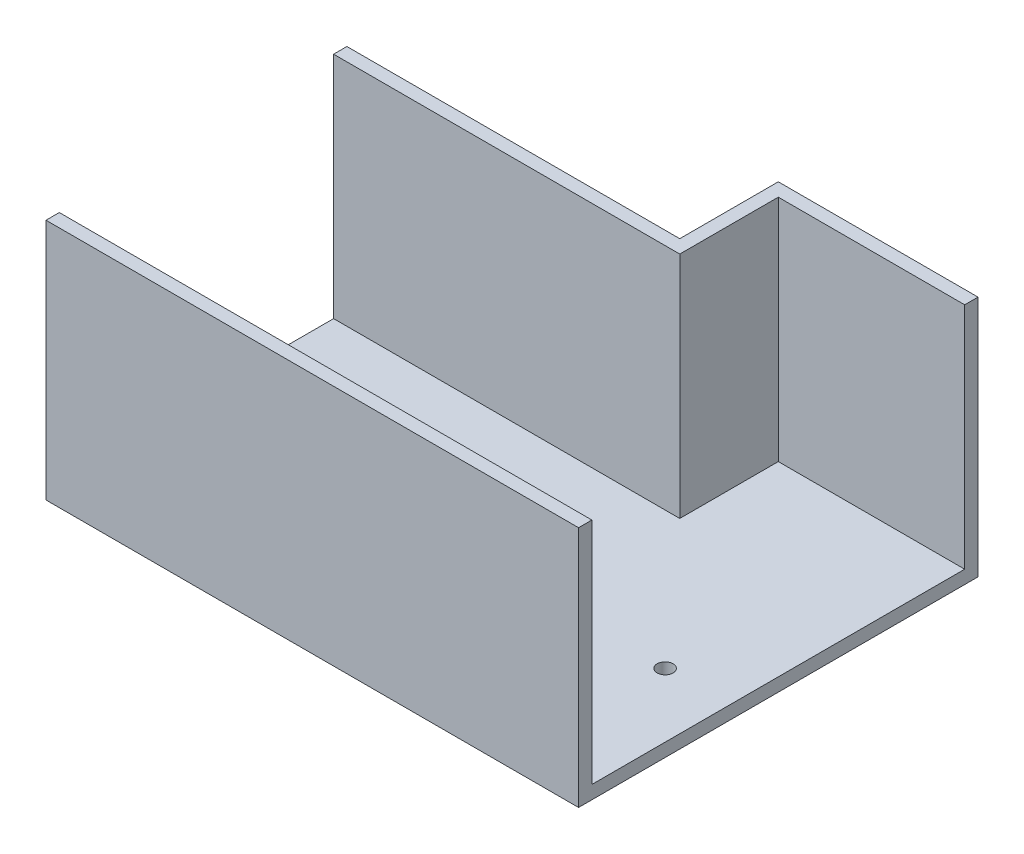
ISO-10303-21;
HEADER;
FILE_DESCRIPTION(('STEP AP214'),'2;1');
FILE_NAME('part.step','',(''),(''),'','','');
FILE_SCHEMA(('AUTOMOTIVE_DESIGN { 1 0 10303 214 1 1 1 1 }'));
ENDSEC;
DATA;
#1=APPLICATION_CONTEXT('core data for automotive mechanical design processes');
#2=APPLICATION_PROTOCOL_DEFINITION('international standard','automotive_design',2000,#1);
#3=PRODUCT_CONTEXT('',#1,'mechanical');
#4=PRODUCT('Part','Part','',(#3));
#5=PRODUCT_RELATED_PRODUCT_CATEGORY('part','',(#4));
#6=PRODUCT_DEFINITION_FORMATION('','',#4);
#7=PRODUCT_DEFINITION_CONTEXT('part definition',#1,'design');
#8=PRODUCT_DEFINITION('design','',#6,#7);
#9=PRODUCT_DEFINITION_SHAPE('','',#8);
#10=(LENGTH_UNIT() NAMED_UNIT(*) SI_UNIT(.MILLI.,.METRE.));
#11=(NAMED_UNIT(*) PLANE_ANGLE_UNIT() SI_UNIT($,.RADIAN.));
#12=(NAMED_UNIT(*) SI_UNIT($,.STERADIAN.) SOLID_ANGLE_UNIT());
#13=UNCERTAINTY_MEASURE_WITH_UNIT(LENGTH_MEASURE(1.E-05),#10,'distance_accuracy_value','');
#14=(GEOMETRIC_REPRESENTATION_CONTEXT(3) GLOBAL_UNCERTAINTY_ASSIGNED_CONTEXT((#13)) GLOBAL_UNIT_ASSIGNED_CONTEXT((#10,
#11,#12)) REPRESENTATION_CONTEXT('',''));
#15=CARTESIAN_POINT('',(0.,0.,0.));
#16=DIRECTION('',(0.,0.,1.));
#17=DIRECTION('',(1.,0.,0.));
#18=AXIS2_PLACEMENT_3D('',#15,#16,#17);
#19=CARTESIAN_POINT('',(0.,0.,0.));
#20=DIRECTION('',(0.,1.,0.));
#21=DIRECTION('',(0.,0.,1.));
#22=AXIS2_PLACEMENT_3D('',#19,#20,#21);
#23=PLANE('',#22);
#24=CARTESIAN_POINT('',(67.2344460808378,0.,-21.5));
#25=DIRECTION('',(0.,1.,0.));
#26=DIRECTION('',(0.,0.,1.));
#27=AXIS2_PLACEMENT_3D('',#24,#25,#26);
#28=CIRCLE('',#27,3.00000000000001);
#29=CARTESIAN_POINT('',(67.2344460808378,0.,-18.5));
#30=VERTEX_POINT('',#29);
#31=EDGE_CURVE('E214',#30,#30,#28,.T.);
#32=ORIENTED_EDGE('',*,*,#31,.F.);
#33=EDGE_LOOP('',(#32));
#34=FACE_BOUND('',#33,.T.);
#35=DIRECTION('',(0.,0.,1.));
#36=VECTOR('',#35,1.);
#37=CARTESIAN_POINT('',(91.2344460808378,0.,0.));
#38=LINE('',#37,#36);
#39=CARTESIAN_POINT('',(91.2344460808378,0.,-110.));
#40=VERTEX_POINT('',#39);
#41=CARTESIAN_POINT('',(91.2344460808378,0.,30.));
#42=VERTEX_POINT('',#41);
#43=EDGE_CURVE('E192',#40,#42,#38,.T.);
#44=ORIENTED_EDGE('',*,*,#43,.F.);
#45=DIRECTION('',(-1.,0.,0.));
#46=VECTOR('',#45,1.);
#47=CARTESIAN_POINT('',(0.,0.,-110.));
#48=LINE('',#47,#46);
#49=CARTESIAN_POINT('',(21.2344460808378,0.,-110.));
#50=VERTEX_POINT('',#49);
#51=EDGE_CURVE('E161',#40,#50,#48,.T.);
#52=ORIENTED_EDGE('',*,*,#51,.T.);
#53=DIRECTION('',(0.,0.,1.));
#54=VECTOR('',#53,1.);
#55=CARTESIAN_POINT('',(21.2344460808378,0.,0.));
#56=LINE('',#55,#54);
#57=CARTESIAN_POINT('',(21.2344460808378,0.,-73.));
#58=VERTEX_POINT('',#57);
#59=EDGE_CURVE('E164',#50,#58,#56,.T.);
#60=ORIENTED_EDGE('',*,*,#59,.T.);
#61=DIRECTION('',(-1.,0.,0.));
#62=VECTOR('',#61,1.);
#63=CARTESIAN_POINT('',(0.,0.,-73.));
#64=LINE('',#63,#62);
#65=CARTESIAN_POINT('',(-108.765553919162,0.,-73.));
#66=VERTEX_POINT('',#65);
#67=EDGE_CURVE('E181',#58,#66,#64,.T.);
#68=ORIENTED_EDGE('',*,*,#67,.T.);
#69=DIRECTION('',(0.,0.,-1.));
#70=VECTOR('',#69,1.);
#71=CARTESIAN_POINT('',(-108.765553919162,0.,0.));
#72=LINE('',#71,#70);
#73=CARTESIAN_POINT('',(-108.765553919162,0.,30.));
#74=VERTEX_POINT('',#73);
#75=EDGE_CURVE('E229',#74,#66,#72,.T.);
#76=ORIENTED_EDGE('',*,*,#75,.F.);
#77=DIRECTION('',(-1.,0.,0.));
#78=VECTOR('',#77,1.);
#79=CARTESIAN_POINT('',(0.,0.,30.));
#80=LINE('',#79,#78);
#81=EDGE_CURVE('E69',#42,#74,#80,.T.);
#82=ORIENTED_EDGE('',*,*,#81,.F.);
#83=EDGE_LOOP('',(#44,#52,#60,#68,#76,#82));
#84=FACE_BOUND('',#83,.T.);
#85=ADVANCED_FACE('F44',(#34,#84),#23,.T.);
#86=CARTESIAN_POINT('',(91.2344460808378,-5.,0.));
#87=DIRECTION('',(-1.,0.,0.));
#88=DIRECTION('',(0.,0.,1.));
#89=AXIS2_PLACEMENT_3D('',#86,#87,#88);
#90=PLANE('',#89);
#91=DIRECTION('',(0.,1.,0.));
#92=VECTOR('',#91,1.);
#93=CARTESIAN_POINT('',(91.2344460808378,-5.,-115.));
#94=LINE('',#93,#92);
#95=CARTESIAN_POINT('',(91.2344460808378,-5.,-115.));
#96=VERTEX_POINT('',#95);
#97=CARTESIAN_POINT('',(91.2344460808378,86.,-115.));
#98=VERTEX_POINT('',#97);
#99=EDGE_CURVE('E48',#96,#98,#94,.T.);
#100=ORIENTED_EDGE('',*,*,#99,.T.);
#101=DIRECTION('',(0.,0.,1.));
#102=VECTOR('',#101,1.);
#103=CARTESIAN_POINT('',(91.2344460808378,86.,0.));
#104=LINE('',#103,#102);
#105=CARTESIAN_POINT('',(91.2344460808378,86.,-110.));
#106=VERTEX_POINT('',#105);
#107=EDGE_CURVE('E174',#98,#106,#104,.T.);
#108=ORIENTED_EDGE('',*,*,#107,.T.);
#109=DIRECTION('',(0.,-1.,0.));
#110=VECTOR('',#109,1.);
#111=CARTESIAN_POINT('',(91.2344460808378,86.,-110.));
#112=LINE('',#111,#110);
#113=EDGE_CURVE('E180',#106,#40,#112,.T.);
#114=ORIENTED_EDGE('',*,*,#113,.T.);
#115=ORIENTED_EDGE('',*,*,#43,.T.);
#116=DIRECTION('',(0.,-1.,0.));
#117=VECTOR('',#116,1.);
#118=CARTESIAN_POINT('',(91.2344460808378,86.,30.));
#119=LINE('',#118,#117);
#120=CARTESIAN_POINT('',(91.2344460808378,86.,30.));
#121=VERTEX_POINT('',#120);
#122=EDGE_CURVE('E183',#121,#42,#119,.T.);
#123=ORIENTED_EDGE('',*,*,#122,.F.);
#124=DIRECTION('',(0.,0.,1.));
#125=VECTOR('',#124,1.);
#126=CARTESIAN_POINT('',(91.2344460808378,86.,0.));
#127=LINE('',#126,#125);
#128=CARTESIAN_POINT('',(91.2344460808378,86.,35.));
#129=VERTEX_POINT('',#128);
#130=EDGE_CURVE('E199',#121,#129,#127,.T.);
#131=ORIENTED_EDGE('',*,*,#130,.T.);
#132=DIRECTION('',(0.,1.,0.));
#133=VECTOR('',#132,1.);
#134=CARTESIAN_POINT('',(91.2344460808378,-5.,35.));
#135=LINE('',#134,#133);
#136=CARTESIAN_POINT('',(91.2344460808378,-5.,35.));
#137=VERTEX_POINT('',#136);
#138=EDGE_CURVE('E11',#137,#129,#135,.T.);
#139=ORIENTED_EDGE('',*,*,#138,.F.);
#140=DIRECTION('',(0.,0.,1.));
#141=VECTOR('',#140,1.);
#142=CARTESIAN_POINT('',(91.2344460808378,-5.,0.));
#143=LINE('',#142,#141);
#144=EDGE_CURVE('E210',#96,#137,#143,.T.);
#145=ORIENTED_EDGE('',*,*,#144,.F.);
#146=EDGE_LOOP('',(#100,#108,#114,#115,#123,#131,#139,#145));
#147=FACE_BOUND('',#146,.T.);
#148=ADVANCED_FACE('F46',(#147),#90,.F.);
#149=CARTESIAN_POINT('',(0.,-5.,35.));
#150=DIRECTION('',(0.,0.,-1.));
#151=DIRECTION('',(-1.,0.,0.));
#152=AXIS2_PLACEMENT_3D('',#149,#150,#151);
#153=PLANE('',#152);
#154=ORIENTED_EDGE('',*,*,#138,.T.);
#155=DIRECTION('',(-1.,0.,0.));
#156=VECTOR('',#155,1.);
#157=CARTESIAN_POINT('',(0.,86.,35.));
#158=LINE('',#157,#156);
#159=CARTESIAN_POINT('',(-108.765553919162,86.,35.));
#160=VERTEX_POINT('',#159);
#161=EDGE_CURVE('E196',#129,#160,#158,.T.);
#162=ORIENTED_EDGE('',*,*,#161,.T.);
#163=DIRECTION('',(0.,1.,0.));
#164=VECTOR('',#163,1.);
#165=CARTESIAN_POINT('',(-108.765553919162,-5.,35.));
#166=LINE('',#165,#164);
#167=CARTESIAN_POINT('',(-108.765553919162,-5.,35.));
#168=VERTEX_POINT('',#167);
#169=EDGE_CURVE('E53',#168,#160,#166,.T.);
#170=ORIENTED_EDGE('',*,*,#169,.F.);
#171=DIRECTION('',(-1.,0.,0.));
#172=VECTOR('',#171,1.);
#173=CARTESIAN_POINT('',(0.,-5.,35.));
#174=LINE('',#173,#172);
#175=EDGE_CURVE('E223',#137,#168,#174,.T.);
#176=ORIENTED_EDGE('',*,*,#175,.F.);
#177=EDGE_LOOP('',(#154,#162,#170,#176));
#178=FACE_BOUND('',#177,.T.);
#179=ADVANCED_FACE('F259',(#178),#153,.F.);
#180=CARTESIAN_POINT('',(-108.765553919162,-5.,0.));
#181=DIRECTION('',(1.,0.,0.));
#182=DIRECTION('',(0.,0.,-1.));
#183=AXIS2_PLACEMENT_3D('',#180,#181,#182);
#184=PLANE('',#183);
#185=ORIENTED_EDGE('',*,*,#169,.T.);
#186=DIRECTION('',(0.,0.,-1.));
#187=VECTOR('',#186,1.);
#188=CARTESIAN_POINT('',(-108.765553919162,86.,0.));
#189=LINE('',#188,#187);
#190=CARTESIAN_POINT('',(-108.765553919162,86.,30.));
#191=VERTEX_POINT('',#190);
#192=EDGE_CURVE('E193',#160,#191,#189,.T.);
#193=ORIENTED_EDGE('',*,*,#192,.T.);
#194=DIRECTION('',(0.,-1.,0.));
#195=VECTOR('',#194,1.);
#196=CARTESIAN_POINT('',(-108.765553919162,86.,30.));
#197=LINE('',#196,#195);
#198=EDGE_CURVE('E204',#191,#74,#197,.T.);
#199=ORIENTED_EDGE('',*,*,#198,.T.);
#200=ORIENTED_EDGE('',*,*,#75,.T.);
#201=DIRECTION('',(0.,-1.,0.));
#202=VECTOR('',#201,1.);
#203=CARTESIAN_POINT('',(-108.765553919162,86.,-73.));
#204=LINE('',#203,#202);
#205=CARTESIAN_POINT('',(-108.765553919162,86.,-73.));
#206=VERTEX_POINT('',#205);
#207=EDGE_CURVE('E61',#206,#66,#204,.T.);
#208=ORIENTED_EDGE('',*,*,#207,.F.);
#209=DIRECTION('',(0.,0.,1.));
#210=VECTOR('',#209,1.);
#211=CARTESIAN_POINT('',(-108.765553919162,86.,0.));
#212=LINE('',#211,#210);
#213=CARTESIAN_POINT('',(-108.765553919162,86.,-78.));
#214=VERTEX_POINT('',#213);
#215=EDGE_CURVE('E149',#214,#206,#212,.T.);
#216=ORIENTED_EDGE('',*,*,#215,.F.);
#217=DIRECTION('',(0.,1.,0.));
#218=VECTOR('',#217,1.);
#219=CARTESIAN_POINT('',(-108.765553919162,-5.,-78.));
#220=LINE('',#219,#218);
#221=CARTESIAN_POINT('',(-108.765553919162,-5.,-78.));
#222=VERTEX_POINT('',#221);
#223=EDGE_CURVE('E138',#222,#214,#220,.T.);
#224=ORIENTED_EDGE('',*,*,#223,.F.);
#225=DIRECTION('',(0.,0.,-1.));
#226=VECTOR('',#225,1.);
#227=CARTESIAN_POINT('',(-108.765553919162,-5.,0.));
#228=LINE('',#227,#226);
#229=EDGE_CURVE('E221',#168,#222,#228,.T.);
#230=ORIENTED_EDGE('',*,*,#229,.F.);
#231=EDGE_LOOP('',(#185,#193,#199,#200,#208,#216,#224,#230));
#232=FACE_BOUND('',#231,.T.);
#233=ADVANCED_FACE('F150',(#232),#184,.F.);
#234=CARTESIAN_POINT('',(0.,-5.,-78.));
#235=DIRECTION('',(0.,0.,-1.));
#236=DIRECTION('',(-1.,0.,0.));
#237=AXIS2_PLACEMENT_3D('',#234,#235,#236);
#238=PLANE('',#237);
#239=ORIENTED_EDGE('',*,*,#223,.T.);
#240=DIRECTION('',(-1.,0.,0.));
#241=VECTOR('',#240,1.);
#242=CARTESIAN_POINT('',(0.,86.,-78.));
#243=LINE('',#242,#241);
#244=CARTESIAN_POINT('',(16.2344460808378,86.,-78.));
#245=VERTEX_POINT('',#244);
#246=EDGE_CURVE('E142',#245,#214,#243,.T.);
#247=ORIENTED_EDGE('',*,*,#246,.F.);
#248=DIRECTION('',(0.,1.,0.));
#249=VECTOR('',#248,1.);
#250=CARTESIAN_POINT('',(16.2344460808378,-5.,-78.));
#251=LINE('',#250,#249);
#252=CARTESIAN_POINT('',(16.2344460808378,-5.,-78.));
#253=VERTEX_POINT('',#252);
#254=EDGE_CURVE('E147',#253,#245,#251,.T.);
#255=ORIENTED_EDGE('',*,*,#254,.F.);
#256=DIRECTION('',(-1.,0.,0.));
#257=VECTOR('',#256,1.);
#258=CARTESIAN_POINT('',(0.,-5.,-78.));
#259=LINE('',#258,#257);
#260=EDGE_CURVE('E144',#253,#222,#259,.T.);
#261=ORIENTED_EDGE('',*,*,#260,.T.);
#262=EDGE_LOOP('',(#239,#247,#255,#261));
#263=FACE_BOUND('',#262,.T.);
#264=ADVANCED_FACE('F140',(#263),#238,.T.);
#265=CARTESIAN_POINT('',(16.2344460808378,-5.,0.));
#266=DIRECTION('',(-1.,0.,0.));
#267=DIRECTION('',(0.,0.,1.));
#268=AXIS2_PLACEMENT_3D('',#265,#266,#267);
#269=PLANE('',#268);
#270=ORIENTED_EDGE('',*,*,#254,.T.);
#271=DIRECTION('',(0.,0.,1.));
#272=VECTOR('',#271,1.);
#273=CARTESIAN_POINT('',(16.2344460808378,86.,0.));
#274=LINE('',#273,#272);
#275=CARTESIAN_POINT('',(16.2344460808378,86.,-115.));
#276=VERTEX_POINT('',#275);
#277=EDGE_CURVE('E160',#276,#245,#274,.T.);
#278=ORIENTED_EDGE('',*,*,#277,.F.);
#279=DIRECTION('',(0.,1.,0.));
#280=VECTOR('',#279,1.);
#281=CARTESIAN_POINT('',(16.2344460808378,-5.,-115.));
#282=LINE('',#281,#280);
#283=CARTESIAN_POINT('',(16.2344460808378,-5.,-115.));
#284=VERTEX_POINT('',#283);
#285=EDGE_CURVE('E234',#284,#276,#282,.T.);
#286=ORIENTED_EDGE('',*,*,#285,.F.);
#287=DIRECTION('',(0.,0.,1.));
#288=VECTOR('',#287,1.);
#289=CARTESIAN_POINT('',(16.2344460808378,-5.,0.));
#290=LINE('',#289,#288);
#291=EDGE_CURVE('E217',#284,#253,#290,.T.);
#292=ORIENTED_EDGE('',*,*,#291,.T.);
#293=EDGE_LOOP('',(#270,#278,#286,#292));
#294=FACE_BOUND('',#293,.T.);
#295=ADVANCED_FACE('F266',(#294),#269,.T.);
#296=CARTESIAN_POINT('',(0.,-5.,-115.));
#297=DIRECTION('',(0.,0.,-1.));
#298=DIRECTION('',(-1.,0.,0.));
#299=AXIS2_PLACEMENT_3D('',#296,#297,#298);
#300=PLANE('',#299);
#301=ORIENTED_EDGE('',*,*,#285,.T.);
#302=DIRECTION('',(-1.,0.,0.));
#303=VECTOR('',#302,1.);
#304=CARTESIAN_POINT('',(0.,86.,-115.));
#305=LINE('',#304,#303);
#306=EDGE_CURVE('E177',#98,#276,#305,.T.);
#307=ORIENTED_EDGE('',*,*,#306,.F.);
#308=ORIENTED_EDGE('',*,*,#99,.F.);
#309=DIRECTION('',(-1.,0.,0.));
#310=VECTOR('',#309,1.);
#311=CARTESIAN_POINT('',(0.,-5.,-115.));
#312=LINE('',#311,#310);
#313=EDGE_CURVE('E213',#96,#284,#312,.T.);
#314=ORIENTED_EDGE('',*,*,#313,.T.);
#315=EDGE_LOOP('',(#301,#307,#308,#314));
#316=FACE_BOUND('',#315,.T.);
#317=ADVANCED_FACE('F242',(#316),#300,.T.);
#318=CARTESIAN_POINT('',(67.2344460808378,-5.,-21.5));
#319=DIRECTION('',(0.,1.,0.));
#320=DIRECTION('',(0.,0.,1.));
#321=AXIS2_PLACEMENT_3D('',#318,#319,#320);
#322=CYLINDRICAL_SURFACE('',#321,3.00000000000001);
#323=CARTESIAN_POINT('',(67.2344460808378,-5.,-21.5));
#324=DIRECTION('',(0.,1.,0.));
#325=DIRECTION('',(0.,0.,1.));
#326=AXIS2_PLACEMENT_3D('',#323,#324,#325);
#327=CIRCLE('',#326,3.00000000000001);
#328=CARTESIAN_POINT('',(67.2344460808378,-5.,-18.5));
#329=VERTEX_POINT('',#328);
#330=EDGE_CURVE('E225',#329,#329,#327,.T.);
#331=ORIENTED_EDGE('',*,*,#330,.F.);
#332=EDGE_LOOP('',(#331));
#333=FACE_BOUND('',#332,.T.);
#334=ORIENTED_EDGE('',*,*,#31,.T.);
#335=EDGE_LOOP('',(#334));
#336=FACE_BOUND('',#335,.T.);
#337=ADVANCED_FACE('F273',(#333,#336),#322,.F.);
#338=CARTESIAN_POINT('',(0.,-5.,0.));
#339=DIRECTION('',(0.,1.,0.));
#340=DIRECTION('',(0.,0.,1.));
#341=AXIS2_PLACEMENT_3D('',#338,#339,#340);
#342=PLANE('',#341);
#343=ORIENTED_EDGE('',*,*,#144,.T.);
#344=ORIENTED_EDGE('',*,*,#175,.T.);
#345=ORIENTED_EDGE('',*,*,#229,.T.);
#346=ORIENTED_EDGE('',*,*,#260,.F.);
#347=ORIENTED_EDGE('',*,*,#291,.F.);
#348=ORIENTED_EDGE('',*,*,#313,.F.);
#349=EDGE_LOOP('',(#343,#344,#345,#346,#347,#348));
#350=FACE_BOUND('',#349,.T.);
#351=ORIENTED_EDGE('',*,*,#330,.T.);
#352=EDGE_LOOP('',(#351));
#353=FACE_BOUND('',#352,.T.);
#354=ADVANCED_FACE('F262',(#350,#353),#342,.F.);
#355=CARTESIAN_POINT('',(0.,86.,30.));
#356=DIRECTION('',(0.,0.,1.));
#357=DIRECTION('',(1.,0.,0.));
#358=AXIS2_PLACEMENT_3D('',#355,#356,#357);
#359=PLANE('',#358);
#360=ORIENTED_EDGE('',*,*,#81,.T.);
#361=ORIENTED_EDGE('',*,*,#198,.F.);
#362=DIRECTION('',(-1.,0.,0.));
#363=VECTOR('',#362,1.);
#364=CARTESIAN_POINT('',(0.,86.,30.));
#365=LINE('',#364,#363);
#366=EDGE_CURVE('E202',#121,#191,#365,.T.);
#367=ORIENTED_EDGE('',*,*,#366,.F.);
#368=ORIENTED_EDGE('',*,*,#122,.T.);
#369=EDGE_LOOP('',(#360,#361,#367,#368));
#370=FACE_BOUND('',#369,.T.);
#371=ADVANCED_FACE('F251',(#370),#359,.F.);
#372=CARTESIAN_POINT('',(0.,86.,0.));
#373=DIRECTION('',(0.,1.,0.));
#374=DIRECTION('',(0.,0.,1.));
#375=AXIS2_PLACEMENT_3D('',#372,#373,#374);
#376=PLANE('',#375);
#377=ORIENTED_EDGE('',*,*,#192,.F.);
#378=ORIENTED_EDGE('',*,*,#161,.F.);
#379=ORIENTED_EDGE('',*,*,#130,.F.);
#380=ORIENTED_EDGE('',*,*,#366,.T.);
#381=EDGE_LOOP('',(#377,#378,#379,#380));
#382=FACE_BOUND('',#381,.T.);
#383=ADVANCED_FACE('F257',(#382),#376,.T.);
#384=CARTESIAN_POINT('',(0.,86.,-73.));
#385=DIRECTION('',(0.,0.,1.));
#386=DIRECTION('',(1.,0.,0.));
#387=AXIS2_PLACEMENT_3D('',#384,#385,#386);
#388=PLANE('',#387);
#389=ORIENTED_EDGE('',*,*,#67,.F.);
#390=DIRECTION('',(0.,-1.,0.));
#391=VECTOR('',#390,1.);
#392=CARTESIAN_POINT('',(21.2344460808378,86.,-73.));
#393=LINE('',#392,#391);
#394=CARTESIAN_POINT('',(21.2344460808378,86.,-73.));
#395=VERTEX_POINT('',#394);
#396=EDGE_CURVE('E189',#395,#58,#393,.T.);
#397=ORIENTED_EDGE('',*,*,#396,.F.);
#398=DIRECTION('',(-1.,0.,0.));
#399=VECTOR('',#398,1.);
#400=CARTESIAN_POINT('',(0.,86.,-73.));
#401=LINE('',#400,#399);
#402=EDGE_CURVE('E154',#395,#206,#401,.T.);
#403=ORIENTED_EDGE('',*,*,#402,.T.);
#404=ORIENTED_EDGE('',*,*,#207,.T.);
#405=EDGE_LOOP('',(#389,#397,#403,#404));
#406=FACE_BOUND('',#405,.T.);
#407=ADVANCED_FACE('F342',(#406),#388,.T.);
#408=CARTESIAN_POINT('',(21.2344460808378,86.,0.));
#409=DIRECTION('',(1.,0.,0.));
#410=DIRECTION('',(0.,0.,-1.));
#411=AXIS2_PLACEMENT_3D('',#408,#409,#410);
#412=PLANE('',#411);
#413=ORIENTED_EDGE('',*,*,#59,.F.);
#414=DIRECTION('',(0.,-1.,0.));
#415=VECTOR('',#414,1.);
#416=CARTESIAN_POINT('',(21.2344460808378,86.,-110.));
#417=LINE('',#416,#415);
#418=CARTESIAN_POINT('',(21.2344460808378,86.,-110.));
#419=VERTEX_POINT('',#418);
#420=EDGE_CURVE('E187',#419,#50,#417,.T.);
#421=ORIENTED_EDGE('',*,*,#420,.F.);
#422=DIRECTION('',(0.,0.,1.));
#423=VECTOR('',#422,1.);
#424=CARTESIAN_POINT('',(21.2344460808378,86.,0.));
#425=LINE('',#424,#423);
#426=EDGE_CURVE('E168',#419,#395,#425,.T.);
#427=ORIENTED_EDGE('',*,*,#426,.T.);
#428=ORIENTED_EDGE('',*,*,#396,.T.);
#429=EDGE_LOOP('',(#413,#421,#427,#428));
#430=FACE_BOUND('',#429,.T.);
#431=ADVANCED_FACE('F351',(#430),#412,.T.);
#432=CARTESIAN_POINT('',(0.,86.,-110.));
#433=DIRECTION('',(0.,0.,1.));
#434=DIRECTION('',(1.,0.,0.));
#435=AXIS2_PLACEMENT_3D('',#432,#433,#434);
#436=PLANE('',#435);
#437=ORIENTED_EDGE('',*,*,#51,.F.);
#438=ORIENTED_EDGE('',*,*,#113,.F.);
#439=DIRECTION('',(-1.,0.,0.));
#440=VECTOR('',#439,1.);
#441=CARTESIAN_POINT('',(0.,86.,-110.));
#442=LINE('',#441,#440);
#443=EDGE_CURVE('E171',#106,#419,#442,.T.);
#444=ORIENTED_EDGE('',*,*,#443,.T.);
#445=ORIENTED_EDGE('',*,*,#420,.T.);
#446=EDGE_LOOP('',(#437,#438,#444,#445));
#447=FACE_BOUND('',#446,.T.);
#448=ADVANCED_FACE('F247',(#447),#436,.T.);
#449=CARTESIAN_POINT('',(0.,86.,0.));
#450=DIRECTION('',(0.,1.,0.));
#451=DIRECTION('',(0.,0.,1.));
#452=AXIS2_PLACEMENT_3D('',#449,#450,#451);
#453=PLANE('',#452);
#454=ORIENTED_EDGE('',*,*,#246,.T.);
#455=ORIENTED_EDGE('',*,*,#215,.T.);
#456=ORIENTED_EDGE('',*,*,#402,.F.);
#457=ORIENTED_EDGE('',*,*,#426,.F.);
#458=ORIENTED_EDGE('',*,*,#443,.F.);
#459=ORIENTED_EDGE('',*,*,#107,.F.);
#460=ORIENTED_EDGE('',*,*,#306,.T.);
#461=ORIENTED_EDGE('',*,*,#277,.T.);
#462=EDGE_LOOP('',(#454,#455,#456,#457,#458,#459,#460,#461));
#463=FACE_BOUND('',#462,.T.);
#464=ADVANCED_FACE('F157',(#463),#453,.T.);
#465=CLOSED_SHELL('',(#85,#148,#179,#233,#264,#295,#317,#337,#354,#371,#383,#407,#431,#448,#464));
#466=MANIFOLD_SOLID_BREP('B2',#465);
#467=ADVANCED_BREP_SHAPE_REPRESENTATION('',(#18,#466),#14);
#468=SHAPE_DEFINITION_REPRESENTATION(#9,#467);
ENDSEC;
END-ISO-10303-21;
